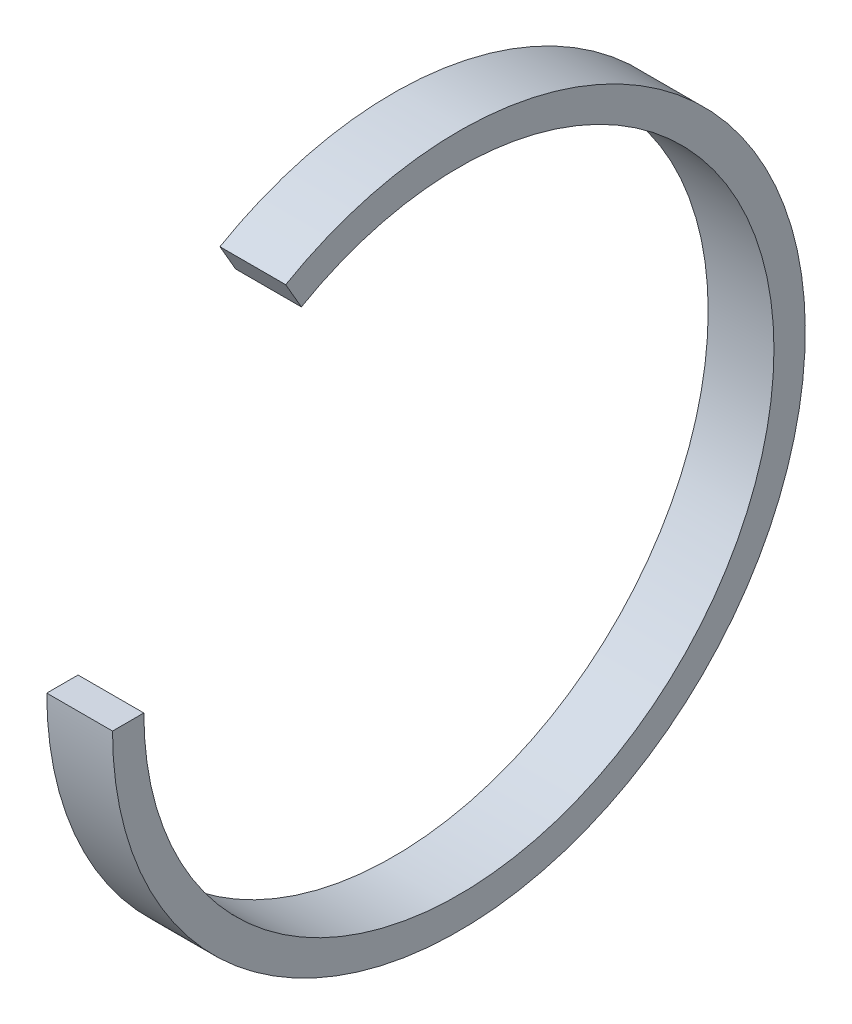
ISO-10303-21;
HEADER;
FILE_DESCRIPTION(('STEP AP214'),'2;1');
FILE_NAME('part.step','',(''),(''),'','','');
FILE_SCHEMA(('AUTOMOTIVE_DESIGN { 1 0 10303 214 1 1 1 1 }'));
ENDSEC;
DATA;
#1=APPLICATION_CONTEXT('core data for automotive mechanical design processes');
#2=APPLICATION_PROTOCOL_DEFINITION('international standard','automotive_design',2000,#1);
#3=PRODUCT_CONTEXT('',#1,'mechanical');
#4=PRODUCT('Part','Part','',(#3));
#5=PRODUCT_RELATED_PRODUCT_CATEGORY('part','',(#4));
#6=PRODUCT_DEFINITION_FORMATION('','',#4);
#7=PRODUCT_DEFINITION_CONTEXT('part definition',#1,'design');
#8=PRODUCT_DEFINITION('design','',#6,#7);
#9=PRODUCT_DEFINITION_SHAPE('','',#8);
#10=(LENGTH_UNIT() NAMED_UNIT(*) SI_UNIT(.MILLI.,.METRE.));
#11=(NAMED_UNIT(*) PLANE_ANGLE_UNIT() SI_UNIT($,.RADIAN.));
#12=(NAMED_UNIT(*) SI_UNIT($,.STERADIAN.) SOLID_ANGLE_UNIT());
#13=UNCERTAINTY_MEASURE_WITH_UNIT(LENGTH_MEASURE(1.E-05),#10,'distance_accuracy_value','');
#14=(GEOMETRIC_REPRESENTATION_CONTEXT(3) GLOBAL_UNCERTAINTY_ASSIGNED_CONTEXT((#13)) GLOBAL_UNIT_ASSIGNED_CONTEXT((#10,
#11,#12)) REPRESENTATION_CONTEXT('',''));
#15=CARTESIAN_POINT('',(0.,0.,0.));
#16=DIRECTION('',(0.,0.,1.));
#17=DIRECTION('',(1.,0.,0.));
#18=AXIS2_PLACEMENT_3D('',#15,#16,#17);
#19=CARTESIAN_POINT('',(10.5,-3.17328842781562E-06,5.496298240794E-06));
#20=DIRECTION('',(-1.,0.,0.));
#21=DIRECTION('',(0.,0.,1.));
#22=AXIS2_PLACEMENT_3D('',#19,#20,#21);
#23=CYLINDRICAL_SURFACE('',#22,50.2999999999998);
#24=CARTESIAN_POINT('',(0.,-3.17328842781562E-06,5.496298240794E-06));
#25=DIRECTION('',(1.,0.,0.));
#26=DIRECTION('',(0.,0.,-1.));
#27=AXIS2_PLACEMENT_3D('',#24,#25,#26);
#28=CIRCLE('',#27,50.2999999999998);
#29=CARTESIAN_POINT('',(0.,-3.17328842165565E-06,50.3000054962982));
#30=VERTEX_POINT('',#29);
#31=CARTESIAN_POINT('',(0.,43.5610775234414,25.1500004969528));
#32=VERTEX_POINT('',#31);
#33=EDGE_CURVE('E103',#30,#32,#28,.T.);
#34=ORIENTED_EDGE('',*,*,#33,.F.);
#35=DIRECTION('',(-1.,0.,0.));
#36=VECTOR('',#35,1.);
#37=CARTESIAN_POINT('',(10.5,-3.17328842165565E-06,50.3000054962982));
#38=LINE('',#37,#36);
#39=CARTESIAN_POINT('',(10.5,-3.17328842165565E-06,50.3000054962982));
#40=VERTEX_POINT('',#39);
#41=EDGE_CURVE('E11',#40,#30,#38,.T.);
#42=ORIENTED_EDGE('',*,*,#41,.F.);
#43=CARTESIAN_POINT('',(10.5,-3.17328842781562E-06,5.496298240794E-06));
#44=DIRECTION('',(1.,0.,0.));
#45=DIRECTION('',(0.,0.,-1.));
#46=AXIS2_PLACEMENT_3D('',#43,#44,#45);
#47=CIRCLE('',#46,50.2999999999998);
#48=CARTESIAN_POINT('',(10.5,43.5610775234414,25.1500004969528));
#49=VERTEX_POINT('',#48);
#50=EDGE_CURVE('E97',#40,#49,#47,.T.);
#51=ORIENTED_EDGE('',*,*,#50,.T.);
#52=DIRECTION('',(-1.,0.,0.));
#53=VECTOR('',#52,1.);
#54=CARTESIAN_POINT('',(10.5,43.5610775234414,25.1500004969528));
#55=LINE('',#54,#53);
#56=EDGE_CURVE('E42',#49,#32,#55,.T.);
#57=ORIENTED_EDGE('',*,*,#56,.T.);
#58=EDGE_LOOP('',(#34,#42,#51,#57));
#59=FACE_BOUND('',#58,.T.);
#60=ADVANCED_FACE('F39',(#59),#23,.F.);
#61=CARTESIAN_POINT('',(10.5,-3.17328842104333E-06,55.3000054962983));
#62=DIRECTION('',(0.,1.,0.));
#63=DIRECTION('',(0.,0.,1.));
#64=AXIS2_PLACEMENT_3D('',#61,#62,#63);
#65=PLANE('',#64);
#66=DIRECTION('',(0.,0.,-1.));
#67=VECTOR('',#66,1.);
#68=CARTESIAN_POINT('',(0.,-3.17328842104333E-06,55.3000054962983));
#69=LINE('',#68,#67);
#70=CARTESIAN_POINT('',(0.,-3.17328842104333E-06,55.3000054962983));
#71=VERTEX_POINT('',#70);
#72=EDGE_CURVE('E99',#71,#30,#69,.T.);
#73=ORIENTED_EDGE('',*,*,#72,.F.);
#74=DIRECTION('',(-1.,0.,0.));
#75=VECTOR('',#74,1.);
#76=CARTESIAN_POINT('',(10.5,-3.17328842104333E-06,55.3000054962983));
#77=LINE('',#76,#75);
#78=CARTESIAN_POINT('',(10.5,-3.17328842104333E-06,55.3000054962983));
#79=VERTEX_POINT('',#78);
#80=EDGE_CURVE('E48',#79,#71,#77,.T.);
#81=ORIENTED_EDGE('',*,*,#80,.F.);
#82=DIRECTION('',(0.,0.,-1.));
#83=VECTOR('',#82,1.);
#84=CARTESIAN_POINT('',(10.5,-3.17328842104333E-06,55.3000054962983));
#85=LINE('',#84,#83);
#86=EDGE_CURVE('E94',#79,#40,#85,.T.);
#87=ORIENTED_EDGE('',*,*,#86,.T.);
#88=ORIENTED_EDGE('',*,*,#41,.T.);
#89=EDGE_LOOP('',(#73,#81,#87,#88));
#90=FACE_BOUND('',#89,.T.);
#91=ADVANCED_FACE('F113',(#90),#65,.T.);
#92=CARTESIAN_POINT('',(10.5,-3.17328842781562E-06,5.496298240794E-06));
#93=DIRECTION('',(-1.,0.,0.));
#94=DIRECTION('',(0.,0.,1.));
#95=AXIS2_PLACEMENT_3D('',#92,#93,#94);
#96=CYLINDRICAL_SURFACE('',#95,55.2999999999998);
#97=CARTESIAN_POINT('',(0.,-3.17328842781562E-06,5.496298240794E-06));
#98=DIRECTION('',(-1.,0.,0.));
#99=DIRECTION('',(0.,0.,1.));
#100=AXIS2_PLACEMENT_3D('',#97,#98,#99);
#101=CIRCLE('',#100,55.2999999999998);
#102=CARTESIAN_POINT('',(0.,47.8912048292797,27.6500000000001));
#103=VERTEX_POINT('',#102);
#104=EDGE_CURVE('E89',#103,#71,#101,.T.);
#105=ORIENTED_EDGE('',*,*,#104,.F.);
#106=DIRECTION('',(-1.,0.,0.));
#107=VECTOR('',#106,1.);
#108=CARTESIAN_POINT('',(10.5,47.8912048292797,27.6500000000001));
#109=LINE('',#108,#107);
#110=CARTESIAN_POINT('',(10.5,47.8912048292797,27.6500000000001));
#111=VERTEX_POINT('',#110);
#112=EDGE_CURVE('E84',#111,#103,#109,.T.);
#113=ORIENTED_EDGE('',*,*,#112,.F.);
#114=CARTESIAN_POINT('',(10.5,-3.17328842781562E-06,5.496298240794E-06));
#115=DIRECTION('',(-1.,0.,0.));
#116=DIRECTION('',(0.,0.,1.));
#117=AXIS2_PLACEMENT_3D('',#114,#115,#116);
#118=CIRCLE('',#117,55.2999999999998);
#119=EDGE_CURVE('E87',#111,#79,#118,.T.);
#120=ORIENTED_EDGE('',*,*,#119,.T.);
#121=ORIENTED_EDGE('',*,*,#80,.T.);
#122=EDGE_LOOP('',(#105,#113,#120,#121));
#123=FACE_BOUND('',#122,.T.);
#124=ADVANCED_FACE('F86',(#123),#96,.T.);
#125=CARTESIAN_POINT('',(10.5,43.5610775234414,25.1500004969528));
#126=DIRECTION('',(0.,-0.499999900609438,0.866025461167599));
#127=DIRECTION('',(0.,-0.866025461167599,-0.499999900609438));
#128=AXIS2_PLACEMENT_3D('',#125,#126,#127);
#129=PLANE('',#128);
#130=DIRECTION('',(0.,0.866025461167599,0.499999900609438));
#131=VECTOR('',#130,1.);
#132=CARTESIAN_POINT('',(0.,43.5610775234414,25.1500004969528));
#133=LINE('',#132,#131);
#134=EDGE_CURVE('E106',#32,#103,#133,.T.);
#135=ORIENTED_EDGE('',*,*,#134,.F.);
#136=ORIENTED_EDGE('',*,*,#56,.F.);
#137=DIRECTION('',(0.,0.866025461167599,0.499999900609438));
#138=VECTOR('',#137,1.);
#139=CARTESIAN_POINT('',(10.5,43.5610775234414,25.1500004969528));
#140=LINE('',#139,#138);
#141=EDGE_CURVE('E93',#49,#111,#140,.T.);
#142=ORIENTED_EDGE('',*,*,#141,.T.);
#143=ORIENTED_EDGE('',*,*,#112,.T.);
#144=EDGE_LOOP('',(#135,#136,#142,#143));
#145=FACE_BOUND('',#144,.T.);
#146=ADVANCED_FACE('F96',(#145),#129,.T.);
#147=CARTESIAN_POINT('',(10.5,-3.17328842781562E-06,5.496298240794E-06));
#148=DIRECTION('',(1.,0.,0.));
#149=DIRECTION('',(0.,0.,-1.));
#150=AXIS2_PLACEMENT_3D('',#147,#148,#149);
#151=PLANE('',#150);
#152=ORIENTED_EDGE('',*,*,#50,.F.);
#153=ORIENTED_EDGE('',*,*,#86,.F.);
#154=ORIENTED_EDGE('',*,*,#119,.F.);
#155=ORIENTED_EDGE('',*,*,#141,.F.);
#156=EDGE_LOOP('',(#152,#153,#154,#155));
#157=FACE_BOUND('',#156,.T.);
#158=ADVANCED_FACE('F92',(#157),#151,.T.);
#159=CARTESIAN_POINT('',(0.,-3.17328842781562E-06,5.496298240794E-06));
#160=DIRECTION('',(1.,0.,0.));
#161=DIRECTION('',(0.,0.,-1.));
#162=AXIS2_PLACEMENT_3D('',#159,#160,#161);
#163=PLANE('',#162);
#164=ORIENTED_EDGE('',*,*,#33,.T.);
#165=ORIENTED_EDGE('',*,*,#134,.T.);
#166=ORIENTED_EDGE('',*,*,#104,.T.);
#167=ORIENTED_EDGE('',*,*,#72,.T.);
#168=EDGE_LOOP('',(#164,#165,#166,#167));
#169=FACE_BOUND('',#168,.T.);
#170=ADVANCED_FACE('F112',(#169),#163,.F.);
#171=CLOSED_SHELL('',(#60,#91,#124,#146,#158,#170));
#172=MANIFOLD_SOLID_BREP('B2',#171);
#173=ADVANCED_BREP_SHAPE_REPRESENTATION('',(#18,#172),#14);
#174=SHAPE_DEFINITION_REPRESENTATION(#9,#173);
ENDSEC;
END-ISO-10303-21;
